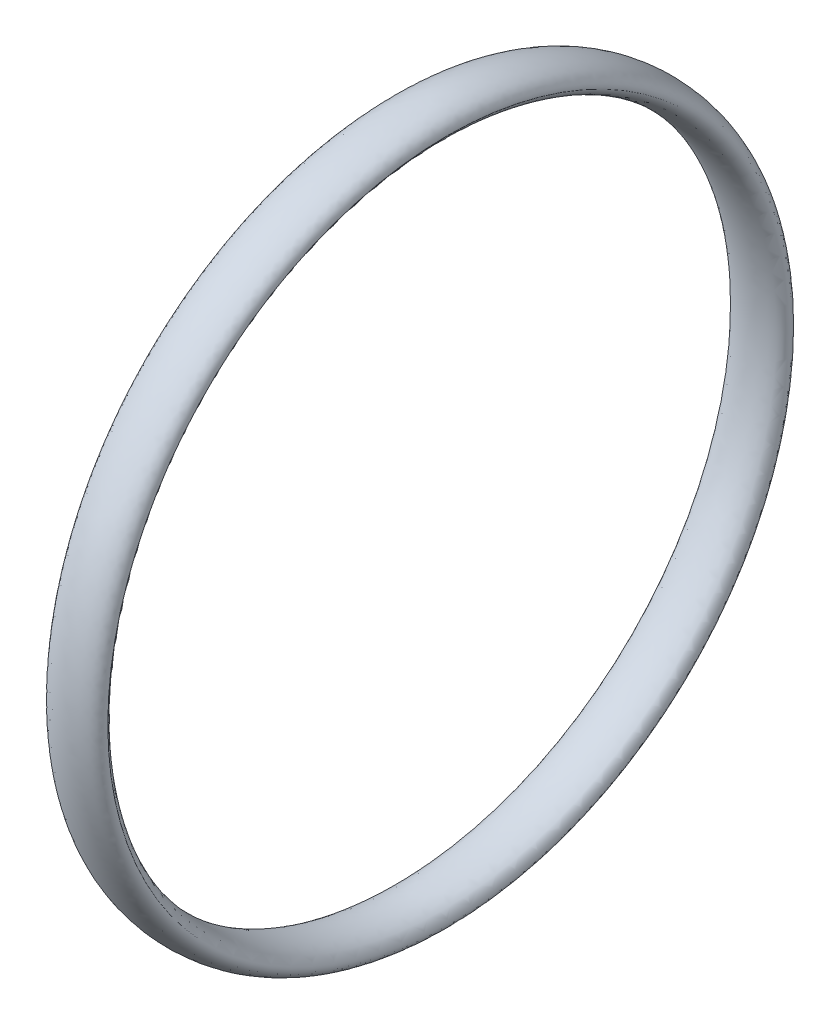
ISO-10303-21;
HEADER;
FILE_DESCRIPTION(('STEP AP214'),'2;1');
FILE_NAME('part.step','',(''),(''),'','','');
FILE_SCHEMA(('AUTOMOTIVE_DESIGN { 1 0 10303 214 1 1 1 1 }'));
ENDSEC;
DATA;
#1=APPLICATION_CONTEXT('core data for automotive mechanical design processes');
#2=APPLICATION_PROTOCOL_DEFINITION('international standard','automotive_design',2000,#1);
#3=PRODUCT_CONTEXT('',#1,'mechanical');
#4=PRODUCT('Part','Part','',(#3));
#5=PRODUCT_RELATED_PRODUCT_CATEGORY('part','',(#4));
#6=PRODUCT_DEFINITION_FORMATION('','',#4);
#7=PRODUCT_DEFINITION_CONTEXT('part definition',#1,'design');
#8=PRODUCT_DEFINITION('design','',#6,#7);
#9=PRODUCT_DEFINITION_SHAPE('','',#8);
#10=(LENGTH_UNIT() NAMED_UNIT(*) SI_UNIT(.MILLI.,.METRE.));
#11=(NAMED_UNIT(*) PLANE_ANGLE_UNIT() SI_UNIT($,.RADIAN.));
#12=(NAMED_UNIT(*) SI_UNIT($,.STERADIAN.) SOLID_ANGLE_UNIT());
#13=UNCERTAINTY_MEASURE_WITH_UNIT(LENGTH_MEASURE(1.E-05),#10,'distance_accuracy_value','');
#14=(GEOMETRIC_REPRESENTATION_CONTEXT(3) GLOBAL_UNCERTAINTY_ASSIGNED_CONTEXT((#13)) GLOBAL_UNIT_ASSIGNED_CONTEXT((#10,
#11,#12)) REPRESENTATION_CONTEXT('',''));
#15=CARTESIAN_POINT('',(0.,0.,0.));
#16=DIRECTION('',(0.,0.,1.));
#17=DIRECTION('',(1.,0.,0.));
#18=AXIS2_PLACEMENT_3D('',#15,#16,#17);
#19=CARTESIAN_POINT('',(0.,0.,-16.5608));
#20=DIRECTION('',(0.,1.,0.));
#21=DIRECTION('',(1.,0.,0.));
#22=AXIS2_PLACEMENT_3D('',#19,#20,#21);
#23=ELLIPSE('',#22,1.36525,0.6858);
#24=CARTESIAN_POINT('',(-1000.,0.,0.));
#25=DIRECTION('',(-1.,0.,0.));
#26=AXIS1_PLACEMENT('',#24,#25);
#27=SURFACE_OF_REVOLUTION('',#23,#26);
#28=ADVANCED_FACE('F40',(),#27,.T.);
#29=CLOSED_SHELL('',(#28));
#30=MANIFOLD_SOLID_BREP('B2',#29);
#31=ADVANCED_BREP_SHAPE_REPRESENTATION('',(#18,#30),#14);
#32=SHAPE_DEFINITION_REPRESENTATION(#9,#31);
ENDSEC;
END-ISO-10303-21;
